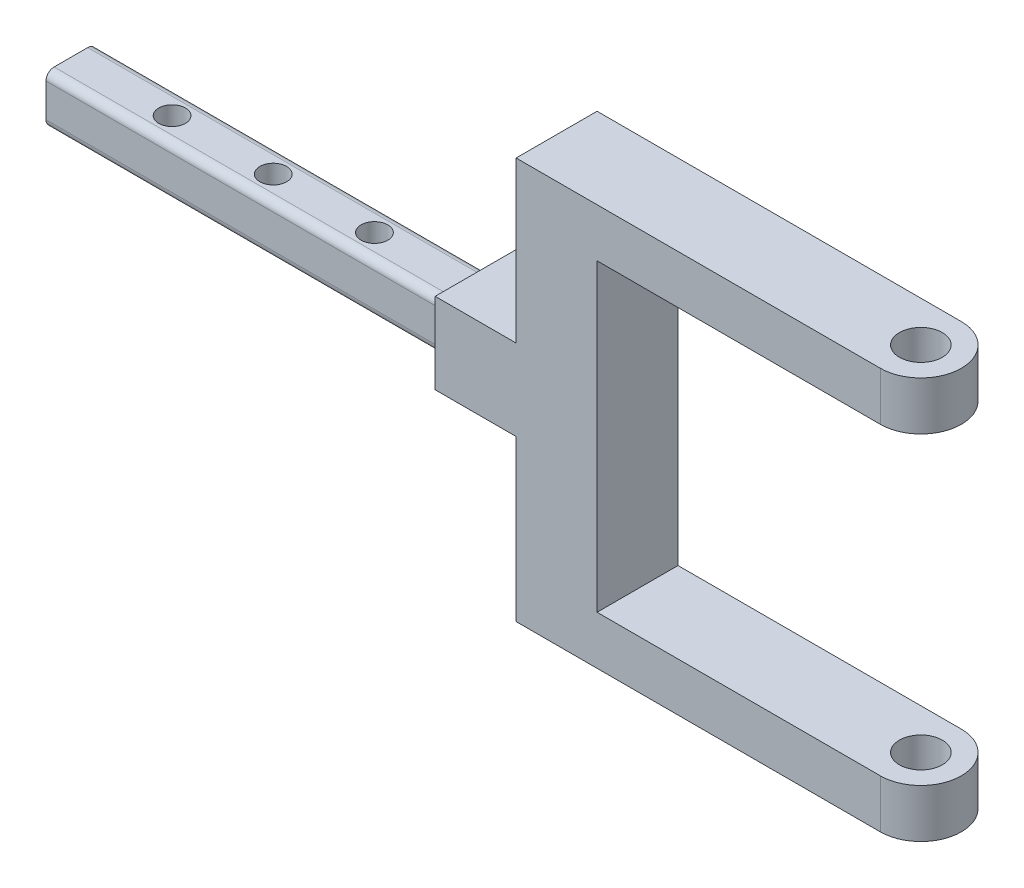
ISO-10303-21;
HEADER;
FILE_DESCRIPTION(('STEP AP214'),'2;1');
FILE_NAME('part.step','',(''),(''),'','','');
FILE_SCHEMA(('AUTOMOTIVE_DESIGN { 1 0 10303 214 1 1 1 1 }'));
ENDSEC;
DATA;
#1=APPLICATION_CONTEXT('core data for automotive mechanical design processes');
#2=APPLICATION_PROTOCOL_DEFINITION('international standard','automotive_design',2000,#1);
#3=PRODUCT_CONTEXT('',#1,'mechanical');
#4=PRODUCT('Part','Part','',(#3));
#5=PRODUCT_RELATED_PRODUCT_CATEGORY('part','',(#4));
#6=PRODUCT_DEFINITION_FORMATION('','',#4);
#7=PRODUCT_DEFINITION_CONTEXT('part definition',#1,'design');
#8=PRODUCT_DEFINITION('design','',#6,#7);
#9=PRODUCT_DEFINITION_SHAPE('','',#8);
#10=(LENGTH_UNIT() NAMED_UNIT(*) SI_UNIT(.MILLI.,.METRE.));
#11=(NAMED_UNIT(*) PLANE_ANGLE_UNIT() SI_UNIT($,.RADIAN.));
#12=(NAMED_UNIT(*) SI_UNIT($,.STERADIAN.) SOLID_ANGLE_UNIT());
#13=UNCERTAINTY_MEASURE_WITH_UNIT(LENGTH_MEASURE(1.E-05),#10,'distance_accuracy_value','');
#14=(GEOMETRIC_REPRESENTATION_CONTEXT(3) GLOBAL_UNCERTAINTY_ASSIGNED_CONTEXT((#13)) GLOBAL_UNIT_ASSIGNED_CONTEXT((#10,
#11,#12)) REPRESENTATION_CONTEXT('',''));
#15=CARTESIAN_POINT('',(0.,0.,0.));
#16=DIRECTION('',(0.,0.,1.));
#17=DIRECTION('',(1.,0.,0.));
#18=AXIS2_PLACEMENT_3D('',#15,#16,#17);
#19=CARTESIAN_POINT('',(40.,24.8,10.));
#20=DIRECTION('',(0.,-1.,0.));
#21=DIRECTION('',(1.,0.,0.));
#22=AXIS2_PLACEMENT_3D('',#19,#20,#21);
#23=PLANE('',#22);
#24=CARTESIAN_POINT('',(35.,24.8,5.));
#25=DIRECTION('',(0.,1.,0.));
#26=DIRECTION('',(-1.,0.,0.));
#27=AXIS2_PLACEMENT_3D('',#24,#25,#26);
#28=CIRCLE('',#27,2.65);
#29=CARTESIAN_POINT('',(32.35,24.8,5.));
#30=VERTEX_POINT('',#29);
#31=EDGE_CURVE('E416',#30,#30,#28,.T.);
#32=ORIENTED_EDGE('',*,*,#31,.F.);
#33=EDGE_LOOP('',(#32));
#34=FACE_BOUND('',#33,.T.);
#35=DIRECTION('',(-1.,0.,0.));
#36=VECTOR('',#35,1.);
#37=CARTESIAN_POINT('',(40.,24.8,10.));
#38=LINE('',#37,#36);
#39=CARTESIAN_POINT('',(35.,24.8,10.));
#40=VERTEX_POINT('',#39);
#41=CARTESIAN_POINT('',(-10.,24.8,10.));
#42=VERTEX_POINT('',#41);
#43=EDGE_CURVE('E269',#40,#42,#38,.T.);
#44=ORIENTED_EDGE('',*,*,#43,.F.);
#45=CARTESIAN_POINT('',(35.,24.8,5.));
#46=DIRECTION('',(0.,1.,0.));
#47=DIRECTION('',(-1.,0.,0.));
#48=AXIS2_PLACEMENT_3D('',#45,#46,#47);
#49=CIRCLE('',#48,5.);
#50=CARTESIAN_POINT('',(35.,24.8,0.));
#51=VERTEX_POINT('',#50);
#52=EDGE_CURVE('E226',#40,#51,#49,.T.);
#53=ORIENTED_EDGE('',*,*,#52,.T.);
#54=DIRECTION('',(-1.,0.,0.));
#55=VECTOR('',#54,1.);
#56=CARTESIAN_POINT('',(40.,24.8,0.));
#57=LINE('',#56,#55);
#58=CARTESIAN_POINT('',(-10.,24.8,0.));
#59=VERTEX_POINT('',#58);
#60=EDGE_CURVE('E255',#51,#59,#57,.T.);
#61=ORIENTED_EDGE('',*,*,#60,.T.);
#62=DIRECTION('',(0.,0.,-1.));
#63=VECTOR('',#62,1.);
#64=CARTESIAN_POINT('',(-10.,24.8,10.));
#65=LINE('',#64,#63);
#66=EDGE_CURVE('E277',#42,#59,#65,.T.);
#67=ORIENTED_EDGE('',*,*,#66,.F.);
#68=EDGE_LOOP('',(#44,#53,#61,#67));
#69=FACE_BOUND('',#68,.T.);
#70=ADVANCED_FACE('F79',(#34,#69),#23,.F.);
#71=CARTESIAN_POINT('',(-9.99999999999999,-24.8,10.));
#72=DIRECTION('',(0.,1.,0.));
#73=DIRECTION('',(-1.,0.,0.));
#74=AXIS2_PLACEMENT_3D('',#71,#72,#73);
#75=PLANE('',#74);
#76=CARTESIAN_POINT('',(35.,-24.8,5.));
#77=DIRECTION('',(0.,1.,0.));
#78=DIRECTION('',(-1.,0.,0.));
#79=AXIS2_PLACEMENT_3D('',#76,#77,#78);
#80=CIRCLE('',#79,2.65);
#81=CARTESIAN_POINT('',(32.35,-24.8,5.));
#82=VERTEX_POINT('',#81);
#83=EDGE_CURVE('E419',#82,#82,#80,.T.);
#84=ORIENTED_EDGE('',*,*,#83,.T.);
#85=EDGE_LOOP('',(#84));
#86=FACE_BOUND('',#85,.T.);
#87=CARTESIAN_POINT('',(35.,-24.8,5.));
#88=DIRECTION('',(0.,1.,0.));
#89=DIRECTION('',(-1.,0.,0.));
#90=AXIS2_PLACEMENT_3D('',#87,#88,#89);
#91=CIRCLE('',#90,5.);
#92=CARTESIAN_POINT('',(35.,-24.8,10.));
#93=VERTEX_POINT('',#92);
#94=CARTESIAN_POINT('',(35.,-24.8,0.));
#95=VERTEX_POINT('',#94);
#96=EDGE_CURVE('E215',#93,#95,#91,.T.);
#97=ORIENTED_EDGE('',*,*,#96,.F.);
#98=DIRECTION('',(1.,0.,0.));
#99=VECTOR('',#98,1.);
#100=CARTESIAN_POINT('',(-9.99999999999999,-24.8,10.));
#101=LINE('',#100,#99);
#102=CARTESIAN_POINT('',(-9.99999999999999,-24.8,10.));
#103=VERTEX_POINT('',#102);
#104=EDGE_CURVE('E220',#103,#93,#101,.T.);
#105=ORIENTED_EDGE('',*,*,#104,.F.);
#106=DIRECTION('',(0.,0.,-1.));
#107=VECTOR('',#106,1.);
#108=CARTESIAN_POINT('',(-9.99999999999999,-24.8,10.));
#109=LINE('',#108,#107);
#110=CARTESIAN_POINT('',(-9.99999999999999,-24.8,0.));
#111=VERTEX_POINT('',#110);
#112=EDGE_CURVE('E275',#103,#111,#109,.T.);
#113=ORIENTED_EDGE('',*,*,#112,.T.);
#114=DIRECTION('',(1.,0.,0.));
#115=VECTOR('',#114,1.);
#116=CARTESIAN_POINT('',(-9.99999999999999,-24.8,0.));
#117=LINE('',#116,#115);
#118=EDGE_CURVE('E222',#111,#95,#117,.T.);
#119=ORIENTED_EDGE('',*,*,#118,.T.);
#120=EDGE_LOOP('',(#97,#105,#113,#119));
#121=FACE_BOUND('',#120,.T.);
#122=ADVANCED_FACE('F217',(#86,#121),#75,.F.);
#123=CARTESIAN_POINT('',(40.,-18.8,10.));
#124=DIRECTION('',(0.,-1.,0.));
#125=DIRECTION('',(1.,0.,0.));
#126=AXIS2_PLACEMENT_3D('',#123,#124,#125);
#127=PLANE('',#126);
#128=CARTESIAN_POINT('',(35.,-18.8,5.));
#129=DIRECTION('',(0.,-1.,0.));
#130=DIRECTION('',(1.,0.,0.));
#131=AXIS2_PLACEMENT_3D('',#128,#129,#130);
#132=CIRCLE('',#131,2.65);
#133=CARTESIAN_POINT('',(37.65,-18.8,5.));
#134=VERTEX_POINT('',#133);
#135=EDGE_CURVE('E286',#134,#134,#132,.T.);
#136=ORIENTED_EDGE('',*,*,#135,.T.);
#137=EDGE_LOOP('',(#136));
#138=FACE_BOUND('',#137,.T.);
#139=DIRECTION('',(-1.,0.,0.));
#140=VECTOR('',#139,1.);
#141=CARTESIAN_POINT('',(40.,-18.8,10.));
#142=LINE('',#141,#140);
#143=CARTESIAN_POINT('',(35.,-18.8,10.));
#144=VERTEX_POINT('',#143);
#145=CARTESIAN_POINT('',(0.,-18.8,10.));
#146=VERTEX_POINT('',#145);
#147=EDGE_CURVE('E241',#144,#146,#142,.T.);
#148=ORIENTED_EDGE('',*,*,#147,.F.);
#149=CARTESIAN_POINT('',(35.,-18.8,5.));
#150=DIRECTION('',(0.,-1.,0.));
#151=DIRECTION('',(1.,0.,0.));
#152=AXIS2_PLACEMENT_3D('',#149,#150,#151);
#153=CIRCLE('',#152,5.);
#154=CARTESIAN_POINT('',(35.,-18.8,0.));
#155=VERTEX_POINT('',#154);
#156=EDGE_CURVE('E232',#155,#144,#153,.T.);
#157=ORIENTED_EDGE('',*,*,#156,.F.);
#158=DIRECTION('',(-1.,0.,0.));
#159=VECTOR('',#158,1.);
#160=CARTESIAN_POINT('',(40.,-18.8,0.));
#161=LINE('',#160,#159);
#162=CARTESIAN_POINT('',(0.,-18.8,0.));
#163=VERTEX_POINT('',#162);
#164=EDGE_CURVE('E262',#155,#163,#161,.T.);
#165=ORIENTED_EDGE('',*,*,#164,.T.);
#166=DIRECTION('',(0.,0.,-1.));
#167=VECTOR('',#166,1.);
#168=CARTESIAN_POINT('',(0.,-18.8,10.));
#169=LINE('',#168,#167);
#170=EDGE_CURVE('E272',#146,#163,#169,.T.);
#171=ORIENTED_EDGE('',*,*,#170,.F.);
#172=EDGE_LOOP('',(#148,#157,#165,#171));
#173=FACE_BOUND('',#172,.T.);
#174=ADVANCED_FACE('F430',(#138,#173),#127,.F.);
#175=CARTESIAN_POINT('',(0.,18.8,10.));
#176=DIRECTION('',(0.,1.,0.));
#177=DIRECTION('',(0.,0.,1.));
#178=AXIS2_PLACEMENT_3D('',#175,#176,#177);
#179=PLANE('',#178);
#180=CARTESIAN_POINT('',(35.,18.8,5.));
#181=DIRECTION('',(0.,1.,0.));
#182=DIRECTION('',(0.,0.,1.));
#183=AXIS2_PLACEMENT_3D('',#180,#181,#182);
#184=CIRCLE('',#183,2.65);
#185=CARTESIAN_POINT('',(35.,18.8,7.65));
#186=VERTEX_POINT('',#185);
#187=EDGE_CURVE('E283',#186,#186,#184,.T.);
#188=ORIENTED_EDGE('',*,*,#187,.T.);
#189=EDGE_LOOP('',(#188));
#190=FACE_BOUND('',#189,.T.);
#191=CARTESIAN_POINT('',(35.,18.8,5.));
#192=DIRECTION('',(0.,1.,0.));
#193=DIRECTION('',(0.,0.,1.));
#194=AXIS2_PLACEMENT_3D('',#191,#192,#193);
#195=CIRCLE('',#194,5.);
#196=CARTESIAN_POINT('',(35.,18.8,10.));
#197=VERTEX_POINT('',#196);
#198=CARTESIAN_POINT('',(35.,18.8,0.));
#199=VERTEX_POINT('',#198);
#200=EDGE_CURVE('E424',#197,#199,#195,.T.);
#201=ORIENTED_EDGE('',*,*,#200,.F.);
#202=DIRECTION('',(1.,0.,0.));
#203=VECTOR('',#202,1.);
#204=CARTESIAN_POINT('',(0.,18.8,10.));
#205=LINE('',#204,#203);
#206=CARTESIAN_POINT('',(0.,18.8,10.));
#207=VERTEX_POINT('',#206);
#208=EDGE_CURVE('E251',#207,#197,#205,.T.);
#209=ORIENTED_EDGE('',*,*,#208,.F.);
#210=DIRECTION('',(0.,0.,-1.));
#211=VECTOR('',#210,1.);
#212=CARTESIAN_POINT('',(0.,18.8,10.));
#213=LINE('',#212,#211);
#214=CARTESIAN_POINT('',(0.,18.8,0.));
#215=VERTEX_POINT('',#214);
#216=EDGE_CURVE('E254',#207,#215,#213,.T.);
#217=ORIENTED_EDGE('',*,*,#216,.T.);
#218=DIRECTION('',(1.,0.,0.));
#219=VECTOR('',#218,1.);
#220=CARTESIAN_POINT('',(0.,18.8,0.));
#221=LINE('',#220,#219);
#222=EDGE_CURVE('E266',#215,#199,#221,.T.);
#223=ORIENTED_EDGE('',*,*,#222,.T.);
#224=EDGE_LOOP('',(#201,#209,#217,#223));
#225=FACE_BOUND('',#224,.T.);
#226=ADVANCED_FACE('F505',(#190,#225),#179,.F.);
#227=CARTESIAN_POINT('',(0.,0.,10.));
#228=DIRECTION('',(0.,0.,1.));
#229=DIRECTION('',(1.,0.,0.));
#230=AXIS2_PLACEMENT_3D('',#227,#228,#229);
#231=PLANE('',#230);
#232=ORIENTED_EDGE('',*,*,#104,.T.);
#233=DIRECTION('',(0.,1.,0.));
#234=VECTOR('',#233,1.);
#235=CARTESIAN_POINT('',(35.,-24.8,10.));
#236=LINE('',#235,#234);
#237=EDGE_CURVE('E229',#93,#144,#236,.T.);
#238=ORIENTED_EDGE('',*,*,#237,.T.);
#239=ORIENTED_EDGE('',*,*,#147,.T.);
#240=DIRECTION('',(0.,1.,0.));
#241=VECTOR('',#240,1.);
#242=CARTESIAN_POINT('',(0.,18.8,10.));
#243=LINE('',#242,#241);
#244=EDGE_CURVE('E244',#146,#207,#243,.T.);
#245=ORIENTED_EDGE('',*,*,#244,.T.);
#246=ORIENTED_EDGE('',*,*,#208,.T.);
#247=DIRECTION('',(0.,1.,0.));
#248=VECTOR('',#247,1.);
#249=CARTESIAN_POINT('',(35.,-24.8,10.));
#250=LINE('',#249,#248);
#251=EDGE_CURVE('E282',#197,#40,#250,.T.);
#252=ORIENTED_EDGE('',*,*,#251,.T.);
#253=ORIENTED_EDGE('',*,*,#43,.T.);
#254=DIRECTION('',(0.,-1.,0.));
#255=VECTOR('',#254,1.);
#256=CARTESIAN_POINT('',(-10.,24.8,10.));
#257=LINE('',#256,#255);
#258=CARTESIAN_POINT('',(-10.,5.,10.));
#259=VERTEX_POINT('',#258);
#260=EDGE_CURVE('E242',#42,#259,#257,.T.);
#261=ORIENTED_EDGE('',*,*,#260,.T.);
#262=DIRECTION('',(1.,0.,0.));
#263=VECTOR('',#262,1.);
#264=CARTESIAN_POINT('',(-20.,5.,10.));
#265=LINE('',#264,#263);
#266=CARTESIAN_POINT('',(-20.,5.,10.));
#267=VERTEX_POINT('',#266);
#268=EDGE_CURVE('E380',#267,#259,#265,.T.);
#269=ORIENTED_EDGE('',*,*,#268,.F.);
#270=DIRECTION('',(0.,1.,0.));
#271=VECTOR('',#270,1.);
#272=CARTESIAN_POINT('',(-20.,0.,10.));
#273=LINE('',#272,#271);
#274=CARTESIAN_POINT('',(-20.,-5.,10.));
#275=VERTEX_POINT('',#274);
#276=EDGE_CURVE('E369',#275,#267,#273,.T.);
#277=ORIENTED_EDGE('',*,*,#276,.F.);
#278=DIRECTION('',(1.,0.,0.));
#279=VECTOR('',#278,1.);
#280=CARTESIAN_POINT('',(-20.,-5.,10.));
#281=LINE('',#280,#279);
#282=CARTESIAN_POINT('',(-10.,-5.,10.));
#283=VERTEX_POINT('',#282);
#284=EDGE_CURVE('E383',#275,#283,#281,.T.);
#285=ORIENTED_EDGE('',*,*,#284,.T.);
#286=EDGE_CURVE('E239',#283,#103,#257,.T.);
#287=ORIENTED_EDGE('',*,*,#286,.T.);
#288=EDGE_LOOP('',(#232,#238,#239,#245,#246,#252,#253,#261,#269,#277,#285,#287));
#289=FACE_BOUND('',#288,.T.);
#290=ADVANCED_FACE('F237',(#289),#231,.T.);
#291=CARTESIAN_POINT('',(0.,0.,0.));
#292=DIRECTION('',(0.,0.,1.));
#293=DIRECTION('',(1.,0.,0.));
#294=AXIS2_PLACEMENT_3D('',#291,#292,#293);
#295=PLANE('',#294);
#296=DIRECTION('',(0.,1.,0.));
#297=VECTOR('',#296,1.);
#298=CARTESIAN_POINT('',(35.,-24.8,0.));
#299=LINE('',#298,#297);
#300=EDGE_CURVE('E225',#95,#155,#299,.T.);
#301=ORIENTED_EDGE('',*,*,#300,.F.);
#302=ORIENTED_EDGE('',*,*,#118,.F.);
#303=DIRECTION('',(0.,-1.,0.));
#304=VECTOR('',#303,1.);
#305=CARTESIAN_POINT('',(-10.,24.8,0.));
#306=LINE('',#305,#304);
#307=CARTESIAN_POINT('',(-10.,-5.,0.));
#308=VERTEX_POINT('',#307);
#309=EDGE_CURVE('E257',#308,#111,#306,.T.);
#310=ORIENTED_EDGE('',*,*,#309,.F.);
#311=DIRECTION('',(1.,0.,0.));
#312=VECTOR('',#311,1.);
#313=CARTESIAN_POINT('',(-20.,-5.,0.));
#314=LINE('',#313,#312);
#315=CARTESIAN_POINT('',(-20.,-5.,0.));
#316=VERTEX_POINT('',#315);
#317=EDGE_CURVE('E258',#316,#308,#314,.T.);
#318=ORIENTED_EDGE('',*,*,#317,.F.);
#319=DIRECTION('',(0.,-1.,0.));
#320=VECTOR('',#319,1.);
#321=CARTESIAN_POINT('',(-20.,0.,0.));
#322=LINE('',#321,#320);
#323=CARTESIAN_POINT('',(-20.,5.,0.));
#324=VERTEX_POINT('',#323);
#325=EDGE_CURVE('E363',#324,#316,#322,.T.);
#326=ORIENTED_EDGE('',*,*,#325,.F.);
#327=DIRECTION('',(1.,0.,0.));
#328=VECTOR('',#327,1.);
#329=CARTESIAN_POINT('',(-20.,5.,0.));
#330=LINE('',#329,#328);
#331=CARTESIAN_POINT('',(-10.,5.,0.));
#332=VERTEX_POINT('',#331);
#333=EDGE_CURVE('E374',#324,#332,#330,.T.);
#334=ORIENTED_EDGE('',*,*,#333,.T.);
#335=EDGE_CURVE('E259',#59,#332,#306,.T.);
#336=ORIENTED_EDGE('',*,*,#335,.F.);
#337=ORIENTED_EDGE('',*,*,#60,.F.);
#338=DIRECTION('',(0.,1.,0.));
#339=VECTOR('',#338,1.);
#340=CARTESIAN_POINT('',(35.,-24.8,0.));
#341=LINE('',#340,#339);
#342=EDGE_CURVE('E280',#199,#51,#341,.T.);
#343=ORIENTED_EDGE('',*,*,#342,.F.);
#344=ORIENTED_EDGE('',*,*,#222,.F.);
#345=DIRECTION('',(0.,1.,0.));
#346=VECTOR('',#345,1.);
#347=CARTESIAN_POINT('',(0.,18.8,0.));
#348=LINE('',#347,#346);
#349=EDGE_CURVE('E264',#163,#215,#348,.T.);
#350=ORIENTED_EDGE('',*,*,#349,.F.);
#351=ORIENTED_EDGE('',*,*,#164,.F.);
#352=EDGE_LOOP('',(#301,#302,#310,#318,#326,#334,#336,#337,#343,#344,#350,#351));
#353=FACE_BOUND('',#352,.T.);
#354=ADVANCED_FACE('F400',(#353),#295,.F.);
#355=CARTESIAN_POINT('',(-20.,0.,0.));
#356=DIRECTION('',(-1.,0.,0.));
#357=DIRECTION('',(0.,-1.,0.));
#358=AXIS2_PLACEMENT_3D('',#355,#356,#357);
#359=PLANE('',#358);
#360=ORIENTED_EDGE('',*,*,#325,.T.);
#361=DIRECTION('',(0.,0.,1.));
#362=VECTOR('',#361,1.);
#363=CARTESIAN_POINT('',(-20.,-5.,0.));
#364=LINE('',#363,#362);
#365=EDGE_CURVE('E366',#316,#275,#364,.T.);
#366=ORIENTED_EDGE('',*,*,#365,.T.);
#367=ORIENTED_EDGE('',*,*,#276,.T.);
#368=DIRECTION('',(0.,0.,1.));
#369=VECTOR('',#368,1.);
#370=CARTESIAN_POINT('',(-20.,5.,0.));
#371=LINE('',#370,#369);
#372=EDGE_CURVE('E371',#324,#267,#371,.T.);
#373=ORIENTED_EDGE('',*,*,#372,.F.);
#374=EDGE_LOOP('',(#360,#366,#367,#373));
#375=FACE_BOUND('',#374,.T.);
#376=DIRECTION('',(0.,1.,0.));
#377=VECTOR('',#376,1.);
#378=CARTESIAN_POINT('',(-20.,0.,8.075));
#379=LINE('',#378,#377);
#380=CARTESIAN_POINT('',(-20.,-2.07500000000001,8.075));
#381=VERTEX_POINT('',#380);
#382=CARTESIAN_POINT('',(-20.,2.075,8.075));
#383=VERTEX_POINT('',#382);
#384=EDGE_CURVE('E334',#381,#383,#379,.T.);
#385=ORIENTED_EDGE('',*,*,#384,.F.);
#386=CARTESIAN_POINT('',(-20.,-2.07500000000001,7.075));
#387=DIRECTION('',(-1.,0.,0.));
#388=DIRECTION('',(0.,-1.,0.));
#389=AXIS2_PLACEMENT_3D('',#386,#387,#388);
#390=CIRCLE('',#389,1.);
#391=CARTESIAN_POINT('',(-20.,-3.07500000000001,7.075));
#392=VERTEX_POINT('',#391);
#393=EDGE_CURVE('E87',#381,#392,#390,.F.);
#394=ORIENTED_EDGE('',*,*,#393,.T.);
#395=DIRECTION('',(0.,0.,-1.));
#396=VECTOR('',#395,1.);
#397=CARTESIAN_POINT('',(-20.,-3.07500000000001,0.));
#398=LINE('',#397,#396);
#399=CARTESIAN_POINT('',(-20.,-3.07500000000001,2.925));
#400=VERTEX_POINT('',#399);
#401=EDGE_CURVE('E358',#392,#400,#398,.T.);
#402=ORIENTED_EDGE('',*,*,#401,.T.);
#403=CARTESIAN_POINT('',(-20.,-2.07500000000001,2.925));
#404=DIRECTION('',(-1.,0.,0.));
#405=DIRECTION('',(0.,-1.,0.));
#406=AXIS2_PLACEMENT_3D('',#403,#404,#405);
#407=CIRCLE('',#406,1.);
#408=CARTESIAN_POINT('',(-20.,-2.07500000000001,1.925));
#409=VERTEX_POINT('',#408);
#410=EDGE_CURVE('E12',#400,#409,#407,.F.);
#411=ORIENTED_EDGE('',*,*,#410,.T.);
#412=DIRECTION('',(0.,1.,0.));
#413=VECTOR('',#412,1.);
#414=CARTESIAN_POINT('',(-20.,0.,1.925));
#415=LINE('',#414,#413);
#416=CARTESIAN_POINT('',(-20.,2.075,1.925));
#417=VERTEX_POINT('',#416);
#418=EDGE_CURVE('E325',#409,#417,#415,.T.);
#419=ORIENTED_EDGE('',*,*,#418,.T.);
#420=CARTESIAN_POINT('',(-20.,2.075,2.925));
#421=DIRECTION('',(-1.,0.,0.));
#422=DIRECTION('',(0.,-1.,0.));
#423=AXIS2_PLACEMENT_3D('',#420,#421,#422);
#424=CIRCLE('',#423,1.);
#425=CARTESIAN_POINT('',(-20.,3.075,2.925));
#426=VERTEX_POINT('',#425);
#427=EDGE_CURVE('E318',#417,#426,#424,.F.);
#428=ORIENTED_EDGE('',*,*,#427,.T.);
#429=DIRECTION('',(0.,0.,-1.));
#430=VECTOR('',#429,1.);
#431=CARTESIAN_POINT('',(-20.,3.075,0.));
#432=LINE('',#431,#430);
#433=CARTESIAN_POINT('',(-20.,3.075,7.075));
#434=VERTEX_POINT('',#433);
#435=EDGE_CURVE('E323',#434,#426,#432,.T.);
#436=ORIENTED_EDGE('',*,*,#435,.F.);
#437=CARTESIAN_POINT('',(-20.,2.075,7.075));
#438=DIRECTION('',(-1.,0.,0.));
#439=DIRECTION('',(0.,-1.,0.));
#440=AXIS2_PLACEMENT_3D('',#437,#438,#439);
#441=CIRCLE('',#440,1.);
#442=EDGE_CURVE('E316',#434,#383,#441,.F.);
#443=ORIENTED_EDGE('',*,*,#442,.T.);
#444=EDGE_LOOP('',(#385,#394,#402,#411,#419,#428,#436,#443));
#445=FACE_BOUND('',#444,.T.);
#446=ADVANCED_FACE('F322',(#375,#445),#359,.T.);
#447=CARTESIAN_POINT('',(-10.,24.8,10.));
#448=DIRECTION('',(1.,0.,0.));
#449=DIRECTION('',(0.,1.,0.));
#450=AXIS2_PLACEMENT_3D('',#447,#448,#449);
#451=PLANE('',#450);
#452=DIRECTION('',(0.,0.,1.));
#453=VECTOR('',#452,1.);
#454=CARTESIAN_POINT('',(-10.,-5.,0.));
#455=LINE('',#454,#453);
#456=EDGE_CURVE('E357',#308,#283,#455,.T.);
#457=ORIENTED_EDGE('',*,*,#456,.F.);
#458=ORIENTED_EDGE('',*,*,#309,.T.);
#459=ORIENTED_EDGE('',*,*,#112,.F.);
#460=ORIENTED_EDGE('',*,*,#286,.F.);
#461=EDGE_LOOP('',(#457,#458,#459,#460));
#462=FACE_BOUND('',#461,.T.);
#463=ADVANCED_FACE('F413',(#462),#451,.F.);
#464=ORIENTED_EDGE('',*,*,#335,.T.);
#465=DIRECTION('',(0.,0.,1.));
#466=VECTOR('',#465,1.);
#467=CARTESIAN_POINT('',(-10.,5.,0.));
#468=LINE('',#467,#466);
#469=EDGE_CURVE('E367',#332,#259,#468,.T.);
#470=ORIENTED_EDGE('',*,*,#469,.T.);
#471=ORIENTED_EDGE('',*,*,#260,.F.);
#472=ORIENTED_EDGE('',*,*,#66,.T.);
#473=EDGE_LOOP('',(#464,#470,#471,#472));
#474=FACE_BOUND('',#473,.T.);
#475=ADVANCED_FACE('F394',(#474),#451,.F.);
#476=CARTESIAN_POINT('',(0.,18.8,10.));
#477=DIRECTION('',(-1.,0.,0.));
#478=DIRECTION('',(0.,-1.,0.));
#479=AXIS2_PLACEMENT_3D('',#476,#477,#478);
#480=PLANE('',#479);
#481=ORIENTED_EDGE('',*,*,#349,.T.);
#482=ORIENTED_EDGE('',*,*,#216,.F.);
#483=ORIENTED_EDGE('',*,*,#244,.F.);
#484=ORIENTED_EDGE('',*,*,#170,.T.);
#485=EDGE_LOOP('',(#481,#482,#483,#484));
#486=FACE_BOUND('',#485,.T.);
#487=ADVANCED_FACE('F502',(#486),#480,.F.);
#488=CARTESIAN_POINT('',(-20.,-5.,0.));
#489=DIRECTION('',(0.,1.,0.));
#490=DIRECTION('',(-1.,0.,0.));
#491=AXIS2_PLACEMENT_3D('',#488,#489,#490);
#492=PLANE('',#491);
#493=ORIENTED_EDGE('',*,*,#456,.T.);
#494=ORIENTED_EDGE('',*,*,#284,.F.);
#495=ORIENTED_EDGE('',*,*,#365,.F.);
#496=ORIENTED_EDGE('',*,*,#317,.T.);
#497=EDGE_LOOP('',(#493,#494,#495,#496));
#498=FACE_BOUND('',#497,.T.);
#499=ADVANCED_FACE('F410',(#498),#492,.F.);
#500=CARTESIAN_POINT('',(-20.,5.,0.));
#501=DIRECTION('',(0.,1.,0.));
#502=DIRECTION('',(-1.,0.,0.));
#503=AXIS2_PLACEMENT_3D('',#500,#501,#502);
#504=PLANE('',#503);
#505=ORIENTED_EDGE('',*,*,#469,.F.);
#506=ORIENTED_EDGE('',*,*,#333,.F.);
#507=ORIENTED_EDGE('',*,*,#372,.T.);
#508=ORIENTED_EDGE('',*,*,#268,.T.);
#509=EDGE_LOOP('',(#505,#506,#507,#508));
#510=FACE_BOUND('',#509,.T.);
#511=ADVANCED_FACE('F405',(#510),#504,.T.);
#512=CARTESIAN_POINT('',(-70.,-3.07500000000001,0.));
#513=DIRECTION('',(0.,-1.,0.));
#514=DIRECTION('',(1.,0.,0.));
#515=AXIS2_PLACEMENT_3D('',#512,#513,#514);
#516=PLANE('',#515);
#517=CARTESIAN_POINT('',(-57.5,-3.07500000000001,5.));
#518=DIRECTION('',(0.,-1.,0.));
#519=DIRECTION('',(1.,0.,0.));
#520=AXIS2_PLACEMENT_3D('',#517,#518,#519);
#521=CIRCLE('',#520,1.65);
#522=CARTESIAN_POINT('',(-55.85,-3.07500000000001,5.));
#523=VERTEX_POINT('',#522);
#524=EDGE_CURVE('E235',#523,#523,#521,.T.);
#525=ORIENTED_EDGE('',*,*,#524,.F.);
#526=EDGE_LOOP('',(#525));
#527=FACE_BOUND('',#526,.T.);
#528=CARTESIAN_POINT('',(-32.5,-3.07500000000001,5.));
#529=DIRECTION('',(0.,-1.,0.));
#530=DIRECTION('',(1.,0.,0.));
#531=AXIS2_PLACEMENT_3D('',#528,#529,#530);
#532=CIRCLE('',#531,1.65);
#533=CARTESIAN_POINT('',(-30.85,-3.07500000000001,5.));
#534=VERTEX_POINT('',#533);
#535=EDGE_CURVE('E709',#534,#534,#532,.T.);
#536=ORIENTED_EDGE('',*,*,#535,.F.);
#537=EDGE_LOOP('',(#536));
#538=FACE_BOUND('',#537,.T.);
#539=CARTESIAN_POINT('',(-45.,-3.07500000000001,5.));
#540=DIRECTION('',(0.,-1.,0.));
#541=DIRECTION('',(1.,0.,0.));
#542=AXIS2_PLACEMENT_3D('',#539,#540,#541);
#543=CIRCLE('',#542,1.65);
#544=CARTESIAN_POINT('',(-43.35,-3.07500000000001,5.));
#545=VERTEX_POINT('',#544);
#546=EDGE_CURVE('E718',#545,#545,#543,.T.);
#547=ORIENTED_EDGE('',*,*,#546,.F.);
#548=EDGE_LOOP('',(#547));
#549=FACE_BOUND('',#548,.T.);
#550=ORIENTED_EDGE('',*,*,#401,.F.);
#551=DIRECTION('',(1.,0.,0.));
#552=VECTOR('',#551,1.);
#553=CARTESIAN_POINT('',(-70.,-3.07500000000001,7.075));
#554=LINE('',#553,#552);
#555=CARTESIAN_POINT('',(-70.,-3.07500000000001,7.075));
#556=VERTEX_POINT('',#555);
#557=EDGE_CURVE('E314',#392,#556,#554,.F.);
#558=ORIENTED_EDGE('',*,*,#557,.T.);
#559=DIRECTION('',(0.,0.,-1.));
#560=VECTOR('',#559,1.);
#561=CARTESIAN_POINT('',(-70.,-3.07500000000001,0.));
#562=LINE('',#561,#560);
#563=CARTESIAN_POINT('',(-70.,-3.07500000000001,2.925));
#564=VERTEX_POINT('',#563);
#565=EDGE_CURVE('E348',#556,#564,#562,.T.);
#566=ORIENTED_EDGE('',*,*,#565,.T.);
#567=DIRECTION('',(1.,0.,0.));
#568=VECTOR('',#567,1.);
#569=CARTESIAN_POINT('',(-70.,-3.07500000000001,2.925));
#570=LINE('',#569,#568);
#571=EDGE_CURVE('E312',#564,#400,#570,.T.);
#572=ORIENTED_EDGE('',*,*,#571,.T.);
#573=EDGE_LOOP('',(#550,#558,#566,#572));
#574=FACE_BOUND('',#573,.T.);
#575=ADVANCED_FACE('F483',(#527,#538,#549,#574),#516,.T.);
#576=CARTESIAN_POINT('',(-70.,0.,8.075));
#577=DIRECTION('',(0.,0.,-1.));
#578=DIRECTION('',(0.,1.,0.));
#579=AXIS2_PLACEMENT_3D('',#576,#577,#578);
#580=PLANE('',#579);
#581=ORIENTED_EDGE('',*,*,#384,.T.);
#582=DIRECTION('',(1.,0.,0.));
#583=VECTOR('',#582,1.);
#584=CARTESIAN_POINT('',(-70.,2.07499999999999,8.075));
#585=LINE('',#584,#583);
#586=CARTESIAN_POINT('',(-70.,2.07499999999999,8.075));
#587=VERTEX_POINT('',#586);
#588=EDGE_CURVE('E297',#383,#587,#585,.F.);
#589=ORIENTED_EDGE('',*,*,#588,.T.);
#590=DIRECTION('',(0.,1.,0.));
#591=VECTOR('',#590,1.);
#592=CARTESIAN_POINT('',(-70.,0.,8.075));
#593=LINE('',#592,#591);
#594=CARTESIAN_POINT('',(-70.,-2.07500000000001,8.075));
#595=VERTEX_POINT('',#594);
#596=EDGE_CURVE('E350',#595,#587,#593,.T.);
#597=ORIENTED_EDGE('',*,*,#596,.F.);
#598=DIRECTION('',(1.,0.,0.));
#599=VECTOR('',#598,1.);
#600=CARTESIAN_POINT('',(-20.,-2.07500000000001,8.075));
#601=LINE('',#600,#599);
#602=EDGE_CURVE('E294',#595,#381,#601,.T.);
#603=ORIENTED_EDGE('',*,*,#602,.T.);
#604=EDGE_LOOP('',(#581,#589,#597,#603));
#605=FACE_BOUND('',#604,.T.);
#606=ADVANCED_FACE('F480',(#605),#580,.F.);
#607=CARTESIAN_POINT('',(-70.,3.07499999999999,0.));
#608=DIRECTION('',(0.,-1.,0.));
#609=DIRECTION('',(1.,0.,0.));
#610=AXIS2_PLACEMENT_3D('',#607,#608,#609);
#611=PLANE('',#610);
#612=CARTESIAN_POINT('',(-57.5,3.07499999999999,5.));
#613=DIRECTION('',(0.,1.,0.));
#614=DIRECTION('',(-1.,0.,0.));
#615=AXIS2_PLACEMENT_3D('',#612,#613,#614);
#616=CIRCLE('',#615,1.65);
#617=CARTESIAN_POINT('',(-59.15,3.07499999999999,5.));
#618=VERTEX_POINT('',#617);
#619=EDGE_CURVE('E715',#618,#618,#616,.T.);
#620=ORIENTED_EDGE('',*,*,#619,.F.);
#621=EDGE_LOOP('',(#620));
#622=FACE_BOUND('',#621,.T.);
#623=CARTESIAN_POINT('',(-32.5,3.075,5.));
#624=DIRECTION('',(0.,1.,0.));
#625=DIRECTION('',(-1.,0.,0.));
#626=AXIS2_PLACEMENT_3D('',#623,#624,#625);
#627=CIRCLE('',#626,1.65);
#628=CARTESIAN_POINT('',(-34.15,3.075,5.));
#629=VERTEX_POINT('',#628);
#630=EDGE_CURVE('E712',#629,#629,#627,.T.);
#631=ORIENTED_EDGE('',*,*,#630,.F.);
#632=EDGE_LOOP('',(#631));
#633=FACE_BOUND('',#632,.T.);
#634=CARTESIAN_POINT('',(-45.,3.07499999999999,5.));
#635=DIRECTION('',(0.,1.,0.));
#636=DIRECTION('',(-1.,0.,0.));
#637=AXIS2_PLACEMENT_3D('',#634,#635,#636);
#638=CIRCLE('',#637,1.65);
#639=CARTESIAN_POINT('',(-46.65,3.07499999999999,5.));
#640=VERTEX_POINT('',#639);
#641=EDGE_CURVE('E714',#640,#640,#638,.T.);
#642=ORIENTED_EDGE('',*,*,#641,.F.);
#643=EDGE_LOOP('',(#642));
#644=FACE_BOUND('',#643,.T.);
#645=DIRECTION('',(0.,0.,-1.));
#646=VECTOR('',#645,1.);
#647=CARTESIAN_POINT('',(-70.,3.07499999999999,0.));
#648=LINE('',#647,#646);
#649=CARTESIAN_POINT('',(-70.,3.07499999999999,7.075));
#650=VERTEX_POINT('',#649);
#651=CARTESIAN_POINT('',(-70.,3.07499999999999,2.925));
#652=VERTEX_POINT('',#651);
#653=EDGE_CURVE('E345',#650,#652,#648,.T.);
#654=ORIENTED_EDGE('',*,*,#653,.F.);
#655=DIRECTION('',(1.,0.,0.));
#656=VECTOR('',#655,1.);
#657=CARTESIAN_POINT('',(-70.,3.07499999999999,7.075));
#658=LINE('',#657,#656);
#659=EDGE_CURVE('E291',#650,#434,#658,.T.);
#660=ORIENTED_EDGE('',*,*,#659,.T.);
#661=ORIENTED_EDGE('',*,*,#435,.T.);
#662=DIRECTION('',(1.,0.,0.));
#663=VECTOR('',#662,1.);
#664=CARTESIAN_POINT('',(-70.,3.07499999999999,2.925));
#665=LINE('',#664,#663);
#666=EDGE_CURVE('E289',#426,#652,#665,.F.);
#667=ORIENTED_EDGE('',*,*,#666,.T.);
#668=EDGE_LOOP('',(#654,#660,#661,#667));
#669=FACE_BOUND('',#668,.T.);
#670=ADVANCED_FACE('F331',(#622,#633,#644,#669),#611,.F.);
#671=CARTESIAN_POINT('',(-70.,0.,1.925));
#672=DIRECTION('',(0.,0.,-1.));
#673=DIRECTION('',(0.,1.,0.));
#674=AXIS2_PLACEMENT_3D('',#671,#672,#673);
#675=PLANE('',#674);
#676=DIRECTION('',(0.,1.,0.));
#677=VECTOR('',#676,1.);
#678=CARTESIAN_POINT('',(-70.,0.,1.925));
#679=LINE('',#678,#677);
#680=CARTESIAN_POINT('',(-70.,-2.07500000000001,1.925));
#681=VERTEX_POINT('',#680);
#682=CARTESIAN_POINT('',(-70.,2.07499999999999,1.925));
#683=VERTEX_POINT('',#682);
#684=EDGE_CURVE('E343',#681,#683,#679,.T.);
#685=ORIENTED_EDGE('',*,*,#684,.T.);
#686=DIRECTION('',(1.,0.,0.));
#687=VECTOR('',#686,1.);
#688=CARTESIAN_POINT('',(-20.,2.075,1.925));
#689=LINE('',#688,#687);
#690=EDGE_CURVE('E309',#683,#417,#689,.T.);
#691=ORIENTED_EDGE('',*,*,#690,.T.);
#692=ORIENTED_EDGE('',*,*,#418,.F.);
#693=DIRECTION('',(1.,0.,0.));
#694=VECTOR('',#693,1.);
#695=CARTESIAN_POINT('',(-70.,-2.07500000000001,1.925));
#696=LINE('',#695,#694);
#697=EDGE_CURVE('E307',#409,#681,#696,.F.);
#698=ORIENTED_EDGE('',*,*,#697,.T.);
#699=EDGE_LOOP('',(#685,#691,#692,#698));
#700=FACE_BOUND('',#699,.T.);
#701=ADVANCED_FACE('F347',(#700),#675,.T.);
#702=CARTESIAN_POINT('',(-70.,0.,0.));
#703=DIRECTION('',(1.,0.,0.));
#704=DIRECTION('',(0.,1.,0.));
#705=AXIS2_PLACEMENT_3D('',#702,#703,#704);
#706=PLANE('',#705);
#707=ORIENTED_EDGE('',*,*,#596,.T.);
#708=CARTESIAN_POINT('',(-70.,2.07499999999999,7.075));
#709=DIRECTION('',(1.,0.,0.));
#710=DIRECTION('',(0.,1.,0.));
#711=AXIS2_PLACEMENT_3D('',#708,#709,#710);
#712=CIRCLE('',#711,1.);
#713=EDGE_CURVE('E305',#587,#650,#712,.F.);
#714=ORIENTED_EDGE('',*,*,#713,.T.);
#715=ORIENTED_EDGE('',*,*,#653,.T.);
#716=CARTESIAN_POINT('',(-70.,2.07499999999999,2.925));
#717=DIRECTION('',(1.,0.,0.));
#718=DIRECTION('',(0.,1.,0.));
#719=AXIS2_PLACEMENT_3D('',#716,#717,#718);
#720=CIRCLE('',#719,1.);
#721=EDGE_CURVE('E303',#652,#683,#720,.F.);
#722=ORIENTED_EDGE('',*,*,#721,.T.);
#723=ORIENTED_EDGE('',*,*,#684,.F.);
#724=CARTESIAN_POINT('',(-70.,-2.07500000000001,2.925));
#725=DIRECTION('',(1.,0.,0.));
#726=DIRECTION('',(0.,1.,0.));
#727=AXIS2_PLACEMENT_3D('',#724,#725,#726);
#728=CIRCLE('',#727,1.);
#729=EDGE_CURVE('E299',#681,#564,#728,.F.);
#730=ORIENTED_EDGE('',*,*,#729,.T.);
#731=ORIENTED_EDGE('',*,*,#565,.F.);
#732=CARTESIAN_POINT('',(-70.,-2.07500000000001,7.075));
#733=DIRECTION('',(1.,0.,0.));
#734=DIRECTION('',(0.,1.,0.));
#735=AXIS2_PLACEMENT_3D('',#732,#733,#734);
#736=CIRCLE('',#735,1.);
#737=EDGE_CURVE('E301',#556,#595,#736,.F.);
#738=ORIENTED_EDGE('',*,*,#737,.T.);
#739=EDGE_LOOP('',(#707,#714,#715,#722,#723,#730,#731,#738));
#740=FACE_BOUND('',#739,.T.);
#741=ADVANCED_FACE('F342',(#740),#706,.F.);
#742=CARTESIAN_POINT('',(35.,-24.8,5.));
#743=DIRECTION('',(0.,1.,0.));
#744=DIRECTION('',(-1.,0.,0.));
#745=AXIS2_PLACEMENT_3D('',#742,#743,#744);
#746=CYLINDRICAL_SURFACE('',#745,5.);
#747=ORIENTED_EDGE('',*,*,#200,.T.);
#748=ORIENTED_EDGE('',*,*,#342,.T.);
#749=ORIENTED_EDGE('',*,*,#52,.F.);
#750=ORIENTED_EDGE('',*,*,#251,.F.);
#751=EDGE_LOOP('',(#747,#748,#749,#750));
#752=FACE_BOUND('',#751,.T.);
#753=ADVANCED_FACE('F588',(#752),#746,.T.);
#754=ORIENTED_EDGE('',*,*,#156,.T.);
#755=ORIENTED_EDGE('',*,*,#237,.F.);
#756=ORIENTED_EDGE('',*,*,#96,.T.);
#757=ORIENTED_EDGE('',*,*,#300,.T.);
#758=EDGE_LOOP('',(#754,#755,#756,#757));
#759=FACE_BOUND('',#758,.T.);
#760=ADVANCED_FACE('F230',(#759),#746,.T.);
#761=CARTESIAN_POINT('',(35.,-24.8,5.));
#762=DIRECTION('',(0.,1.,0.));
#763=DIRECTION('',(-1.,0.,0.));
#764=AXIS2_PLACEMENT_3D('',#761,#762,#763);
#765=CYLINDRICAL_SURFACE('',#764,2.65);
#766=ORIENTED_EDGE('',*,*,#31,.T.);
#767=EDGE_LOOP('',(#766));
#768=FACE_BOUND('',#767,.T.);
#769=ORIENTED_EDGE('',*,*,#187,.F.);
#770=EDGE_LOOP('',(#769));
#771=FACE_BOUND('',#770,.T.);
#772=ADVANCED_FACE('F436',(#768,#771),#765,.F.);
#773=ORIENTED_EDGE('',*,*,#83,.F.);
#774=EDGE_LOOP('',(#773));
#775=FACE_BOUND('',#774,.T.);
#776=ORIENTED_EDGE('',*,*,#135,.F.);
#777=EDGE_LOOP('',(#776));
#778=FACE_BOUND('',#777,.T.);
#779=ADVANCED_FACE('F433',(#775,#778),#765,.F.);
#780=CARTESIAN_POINT('',(-45.,-24.8,5.));
#781=DIRECTION('',(0.,1.,0.));
#782=DIRECTION('',(-1.,0.,0.));
#783=AXIS2_PLACEMENT_3D('',#780,#781,#782);
#784=CYLINDRICAL_SURFACE('',#783,1.65);
#785=ORIENTED_EDGE('',*,*,#546,.T.);
#786=EDGE_LOOP('',(#785));
#787=FACE_BOUND('',#786,.T.);
#788=ORIENTED_EDGE('',*,*,#641,.T.);
#789=EDGE_LOOP('',(#788));
#790=FACE_BOUND('',#789,.T.);
#791=ADVANCED_FACE('F435',(#787,#790),#784,.F.);
#792=CARTESIAN_POINT('',(-32.5,-24.8,5.));
#793=DIRECTION('',(0.,1.,0.));
#794=DIRECTION('',(-1.,0.,0.));
#795=AXIS2_PLACEMENT_3D('',#792,#793,#794);
#796=CYLINDRICAL_SURFACE('',#795,1.65);
#797=ORIENTED_EDGE('',*,*,#535,.T.);
#798=EDGE_LOOP('',(#797));
#799=FACE_BOUND('',#798,.T.);
#800=ORIENTED_EDGE('',*,*,#630,.T.);
#801=EDGE_LOOP('',(#800));
#802=FACE_BOUND('',#801,.T.);
#803=ADVANCED_FACE('F443',(#799,#802),#796,.F.);
#804=CARTESIAN_POINT('',(-57.5,-24.8,5.));
#805=DIRECTION('',(0.,1.,0.));
#806=DIRECTION('',(-1.,0.,0.));
#807=AXIS2_PLACEMENT_3D('',#804,#805,#806);
#808=CYLINDRICAL_SURFACE('',#807,1.65);
#809=ORIENTED_EDGE('',*,*,#524,.T.);
#810=EDGE_LOOP('',(#809));
#811=FACE_BOUND('',#810,.T.);
#812=ORIENTED_EDGE('',*,*,#619,.T.);
#813=EDGE_LOOP('',(#812));
#814=FACE_BOUND('',#813,.T.);
#815=ADVANCED_FACE('F464',(#811,#814),#808,.F.);
#816=CARTESIAN_POINT('',(-70.,2.07499999999999,7.075));
#817=DIRECTION('',(1.,0.,0.));
#818=DIRECTION('',(0.,1.,0.));
#819=AXIS2_PLACEMENT_3D('',#816,#817,#818);
#820=CYLINDRICAL_SURFACE('',#819,1.);
#821=ORIENTED_EDGE('',*,*,#713,.F.);
#822=ORIENTED_EDGE('',*,*,#588,.F.);
#823=ORIENTED_EDGE('',*,*,#442,.F.);
#824=ORIENTED_EDGE('',*,*,#659,.F.);
#825=EDGE_LOOP('',(#821,#822,#823,#824));
#826=FACE_BOUND('',#825,.T.);
#827=ADVANCED_FACE('F461',(#826),#820,.T.);
#828=CARTESIAN_POINT('',(-70.,2.07499999999999,2.925));
#829=DIRECTION('',(-1.,0.,0.));
#830=DIRECTION('',(0.,-1.,0.));
#831=AXIS2_PLACEMENT_3D('',#828,#829,#830);
#832=CYLINDRICAL_SURFACE('',#831,1.);
#833=ORIENTED_EDGE('',*,*,#721,.F.);
#834=ORIENTED_EDGE('',*,*,#666,.F.);
#835=ORIENTED_EDGE('',*,*,#427,.F.);
#836=ORIENTED_EDGE('',*,*,#690,.F.);
#837=EDGE_LOOP('',(#833,#834,#835,#836));
#838=FACE_BOUND('',#837,.T.);
#839=ADVANCED_FACE('F337',(#838),#832,.T.);
#840=CARTESIAN_POINT('',(-70.,-2.07500000000001,7.075));
#841=DIRECTION('',(-1.,0.,0.));
#842=DIRECTION('',(0.,-1.,0.));
#843=AXIS2_PLACEMENT_3D('',#840,#841,#842);
#844=CYLINDRICAL_SURFACE('',#843,1.);
#845=ORIENTED_EDGE('',*,*,#737,.F.);
#846=ORIENTED_EDGE('',*,*,#557,.F.);
#847=ORIENTED_EDGE('',*,*,#393,.F.);
#848=ORIENTED_EDGE('',*,*,#602,.F.);
#849=EDGE_LOOP('',(#845,#846,#847,#848));
#850=FACE_BOUND('',#849,.T.);
#851=ADVANCED_FACE('F467',(#850),#844,.T.);
#852=CARTESIAN_POINT('',(-70.,-2.07500000000001,2.925));
#853=DIRECTION('',(1.,0.,0.));
#854=DIRECTION('',(0.,1.,0.));
#855=AXIS2_PLACEMENT_3D('',#852,#853,#854);
#856=CYLINDRICAL_SURFACE('',#855,1.);
#857=ORIENTED_EDGE('',*,*,#729,.F.);
#858=ORIENTED_EDGE('',*,*,#697,.F.);
#859=ORIENTED_EDGE('',*,*,#410,.F.);
#860=ORIENTED_EDGE('',*,*,#571,.F.);
#861=EDGE_LOOP('',(#857,#858,#859,#860));
#862=FACE_BOUND('',#861,.T.);
#863=ADVANCED_FACE('F81',(#862),#856,.T.);
#864=CLOSED_SHELL('',(#70,#122,#174,#226,#290,#354,#446,#463,#475,#487,#499,#511,#575,#606,#670,
#701,#741,#753,#760,#772,#779,#791,#803,#815,#827,#839,#851,#863));
#865=MANIFOLD_SOLID_BREP('B2',#864);
#866=ADVANCED_BREP_SHAPE_REPRESENTATION('',(#18,#865),#14);
#867=SHAPE_DEFINITION_REPRESENTATION(#9,#866);
ENDSEC;
END-ISO-10303-21;
